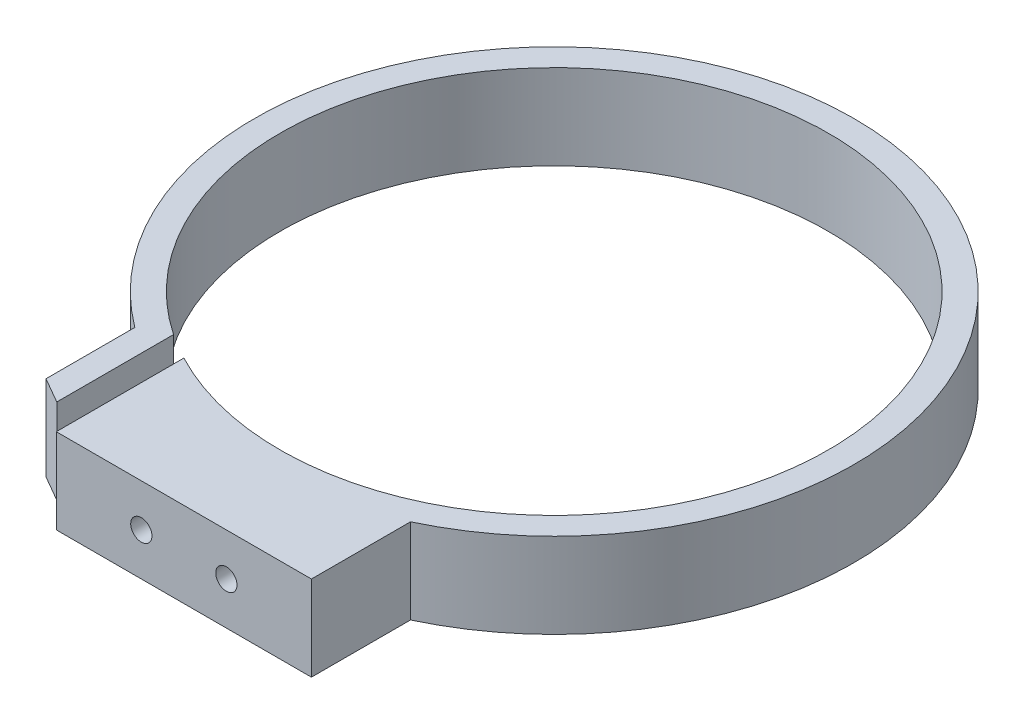
ISO-10303-21;
HEADER;
FILE_DESCRIPTION(('STEP AP214'),'2;1');
FILE_NAME('part.step','',(''),(''),'','','');
FILE_SCHEMA(('AUTOMOTIVE_DESIGN { 1 0 10303 214 1 1 1 1 }'));
ENDSEC;
DATA;
#1=APPLICATION_CONTEXT('core data for automotive mechanical design processes');
#2=APPLICATION_PROTOCOL_DEFINITION('international standard','automotive_design',2000,#1);
#3=PRODUCT_CONTEXT('',#1,'mechanical');
#4=PRODUCT('Part','Part','',(#3));
#5=PRODUCT_RELATED_PRODUCT_CATEGORY('part','',(#4));
#6=PRODUCT_DEFINITION_FORMATION('','',#4);
#7=PRODUCT_DEFINITION_CONTEXT('part definition',#1,'design');
#8=PRODUCT_DEFINITION('design','',#6,#7);
#9=PRODUCT_DEFINITION_SHAPE('','',#8);
#10=(LENGTH_UNIT() NAMED_UNIT(*) SI_UNIT(.MILLI.,.METRE.));
#11=(NAMED_UNIT(*) PLANE_ANGLE_UNIT() SI_UNIT($,.RADIAN.));
#12=(NAMED_UNIT(*) SI_UNIT($,.STERADIAN.) SOLID_ANGLE_UNIT());
#13=UNCERTAINTY_MEASURE_WITH_UNIT(LENGTH_MEASURE(1.E-05),#10,'distance_accuracy_value','');
#14=(GEOMETRIC_REPRESENTATION_CONTEXT(3) GLOBAL_UNCERTAINTY_ASSIGNED_CONTEXT((#13)) GLOBAL_UNIT_ASSIGNED_CONTEXT((#10,
#11,#12)) REPRESENTATION_CONTEXT('',''));
#15=CARTESIAN_POINT('',(0.,0.,0.));
#16=DIRECTION('',(0.,0.,1.));
#17=DIRECTION('',(1.,0.,0.));
#18=AXIS2_PLACEMENT_3D('',#15,#16,#17);
#19=CARTESIAN_POINT('',(0.,10.,0.));
#20=DIRECTION('',(0.,1.,0.));
#21=DIRECTION('',(0.,0.,1.));
#22=AXIS2_PLACEMENT_3D('',#19,#20,#21);
#23=PLANE('',#22);
#24=CARTESIAN_POINT('',(0.,10.,0.));
#25=DIRECTION('',(0.,1.,0.));
#26=DIRECTION('',(0.,0.,1.));
#27=AXIS2_PLACEMENT_3D('',#24,#25,#26);
#28=CIRCLE('',#27,35.25);
#29=CARTESIAN_POINT('',(15.,10.,31.8992554772051));
#30=VERTEX_POINT('',#29);
#31=CARTESIAN_POINT('',(-21.,10.,28.3118791322653));
#32=VERTEX_POINT('',#31);
#33=EDGE_CURVE('E173',#30,#32,#28,.T.);
#34=ORIENTED_EDGE('',*,*,#33,.T.);
#35=DIRECTION('',(0.,0.,1.));
#36=VECTOR('',#35,1.);
#37=CARTESIAN_POINT('',(-21.,10.,26.7593441623669));
#38=LINE('',#37,#36);
#39=CARTESIAN_POINT('',(-21.,10.,38.7593441623669));
#40=VERTEX_POINT('',#39);
#41=EDGE_CURVE('E140',#32,#40,#38,.T.);
#42=ORIENTED_EDGE('',*,*,#41,.T.);
#43=DIRECTION('',(0.866025403784437,0.,0.500000000000002));
#44=VECTOR('',#43,1.);
#45=CARTESIAN_POINT('',(-18.,10.,40.4913949699358));
#46=LINE('',#45,#44);
#47=CARTESIAN_POINT('',(-18.,10.,40.4913949699358));
#48=VERTEX_POINT('',#47);
#49=EDGE_CURVE('E149',#40,#48,#46,.T.);
#50=ORIENTED_EDGE('',*,*,#49,.T.);
#51=DIRECTION('',(0.,0.,1.));
#52=VECTOR('',#51,1.);
#53=CARTESIAN_POINT('',(-18.,10.,31.8992554772051));
#54=LINE('',#53,#52);
#55=CARTESIAN_POINT('',(-18.,10.,26.7593441623669));
#56=VERTEX_POINT('',#55);
#57=EDGE_CURVE('E147',#56,#48,#54,.T.);
#58=ORIENTED_EDGE('',*,*,#57,.F.);
#59=CARTESIAN_POINT('',(0.,10.,0.));
#60=DIRECTION('',(0.,1.,0.));
#61=DIRECTION('',(0.,0.,1.));
#62=AXIS2_PLACEMENT_3D('',#59,#60,#61);
#63=CIRCLE('',#62,32.25);
#64=CARTESIAN_POINT('',(-15.,10.,28.5492994660114));
#65=VERTEX_POINT('',#64);
#66=EDGE_CURVE('E161',#65,#56,#63,.T.);
#67=ORIENTED_EDGE('',*,*,#66,.F.);
#68=DIRECTION('',(0.,0.,1.));
#69=VECTOR('',#68,1.);
#70=CARTESIAN_POINT('',(-15.,10.,31.8992554772051));
#71=LINE('',#70,#69);
#72=CARTESIAN_POINT('',(-15.,10.,43.5492994660114));
#73=VERTEX_POINT('',#72);
#74=EDGE_CURVE('E175',#65,#73,#71,.T.);
#75=ORIENTED_EDGE('',*,*,#74,.T.);
#76=DIRECTION('',(1.,0.,0.));
#77=VECTOR('',#76,1.);
#78=CARTESIAN_POINT('',(-15.,10.,43.5492994660114));
#79=LINE('',#78,#77);
#80=CARTESIAN_POINT('',(15.,10.,43.5492994660114));
#81=VERTEX_POINT('',#80);
#82=EDGE_CURVE('E167',#73,#81,#79,.T.);
#83=ORIENTED_EDGE('',*,*,#82,.T.);
#84=DIRECTION('',(0.,0.,-1.));
#85=VECTOR('',#84,1.);
#86=CARTESIAN_POINT('',(15.,10.,43.5492994660114));
#87=LINE('',#86,#85);
#88=EDGE_CURVE('E170',#81,#30,#87,.T.);
#89=ORIENTED_EDGE('',*,*,#88,.T.);
#90=EDGE_LOOP('',(#34,#42,#50,#58,#67,#75,#83,#89));
#91=FACE_BOUND('',#90,.T.);
#92=ADVANCED_FACE('F37',(#91),#23,.T.);
#93=CARTESIAN_POINT('',(0.,0.,0.));
#94=DIRECTION('',(0.,1.,0.));
#95=DIRECTION('',(0.,0.,1.));
#96=AXIS2_PLACEMENT_3D('',#93,#94,#95);
#97=PLANE('',#96);
#98=DIRECTION('',(0.,0.,-1.));
#99=VECTOR('',#98,1.);
#100=CARTESIAN_POINT('',(-21.,0.,26.7593441623669));
#101=LINE('',#100,#99);
#102=CARTESIAN_POINT('',(-21.,0.,38.7593441623669));
#103=VERTEX_POINT('',#102);
#104=CARTESIAN_POINT('',(-21.,0.,28.3118791322653));
#105=VERTEX_POINT('',#104);
#106=EDGE_CURVE('E141',#103,#105,#101,.T.);
#107=ORIENTED_EDGE('',*,*,#106,.T.);
#108=CARTESIAN_POINT('',(0.,0.,0.));
#109=DIRECTION('',(0.,1.,0.));
#110=DIRECTION('',(0.,0.,1.));
#111=AXIS2_PLACEMENT_3D('',#108,#109,#110);
#112=CIRCLE('',#111,35.25);
#113=CARTESIAN_POINT('',(15.,0.,31.8992554772051));
#114=VERTEX_POINT('',#113);
#115=EDGE_CURVE('E55',#114,#105,#112,.T.);
#116=ORIENTED_EDGE('',*,*,#115,.F.);
#117=DIRECTION('',(0.,0.,-1.));
#118=VECTOR('',#117,1.);
#119=CARTESIAN_POINT('',(15.,0.,43.5492994660114));
#120=LINE('',#119,#118);
#121=CARTESIAN_POINT('',(15.,0.,43.5492994660114));
#122=VERTEX_POINT('',#121);
#123=EDGE_CURVE('E180',#122,#114,#120,.T.);
#124=ORIENTED_EDGE('',*,*,#123,.F.);
#125=DIRECTION('',(1.,0.,0.));
#126=VECTOR('',#125,1.);
#127=CARTESIAN_POINT('',(-15.,0.,43.5492994660114));
#128=LINE('',#127,#126);
#129=CARTESIAN_POINT('',(-15.,0.,43.5492994660114));
#130=VERTEX_POINT('',#129);
#131=EDGE_CURVE('E164',#130,#122,#128,.T.);
#132=ORIENTED_EDGE('',*,*,#131,.F.);
#133=DIRECTION('',(0.,0.,1.));
#134=VECTOR('',#133,1.);
#135=CARTESIAN_POINT('',(-15.,0.,31.8992554772051));
#136=LINE('',#135,#134);
#137=CARTESIAN_POINT('',(-15.,0.,28.5492994660114));
#138=VERTEX_POINT('',#137);
#139=EDGE_CURVE('E171',#138,#130,#136,.T.);
#140=ORIENTED_EDGE('',*,*,#139,.F.);
#141=CARTESIAN_POINT('',(0.,0.,0.));
#142=DIRECTION('',(0.,1.,0.));
#143=DIRECTION('',(0.,0.,1.));
#144=AXIS2_PLACEMENT_3D('',#141,#142,#143);
#145=CIRCLE('',#144,32.25);
#146=CARTESIAN_POINT('',(-18.,0.,26.7593441623669));
#147=VERTEX_POINT('',#146);
#148=EDGE_CURVE('E159',#138,#147,#145,.T.);
#149=ORIENTED_EDGE('',*,*,#148,.T.);
#150=DIRECTION('',(0.,0.,-1.));
#151=VECTOR('',#150,1.);
#152=CARTESIAN_POINT('',(-18.,0.,31.8992554772051));
#153=LINE('',#152,#151);
#154=CARTESIAN_POINT('',(-18.,0.,40.4913949699358));
#155=VERTEX_POINT('',#154);
#156=EDGE_CURVE('E157',#155,#147,#153,.T.);
#157=ORIENTED_EDGE('',*,*,#156,.F.);
#158=DIRECTION('',(-0.866025403784438,0.,-0.500000000000002));
#159=VECTOR('',#158,1.);
#160=CARTESIAN_POINT('',(-18.,0.,40.4913949699358));
#161=LINE('',#160,#159);
#162=EDGE_CURVE('E144',#155,#103,#161,.T.);
#163=ORIENTED_EDGE('',*,*,#162,.T.);
#164=EDGE_LOOP('',(#107,#116,#124,#132,#140,#149,#157,#163));
#165=FACE_BOUND('',#164,.T.);
#166=ADVANCED_FACE('F203',(#165),#97,.F.);
#167=CARTESIAN_POINT('',(-15.,10.,43.5492994660114));
#168=DIRECTION('',(0.,0.,-1.));
#169=DIRECTION('',(-1.,0.,0.));
#170=AXIS2_PLACEMENT_3D('',#167,#168,#169);
#171=PLANE('',#170);
#172=CARTESIAN_POINT('',(-5.,5.,43.5492994660114));
#173=DIRECTION('',(0.,0.,1.));
#174=DIRECTION('',(1.,0.,0.));
#175=AXIS2_PLACEMENT_3D('',#172,#173,#174);
#176=CIRCLE('',#175,1.24999999999999);
#177=CARTESIAN_POINT('',(-3.75000000000001,5.,43.5492994660114));
#178=VERTEX_POINT('',#177);
#179=EDGE_CURVE('E118',#178,#178,#176,.T.);
#180=ORIENTED_EDGE('',*,*,#179,.F.);
#181=EDGE_LOOP('',(#180));
#182=FACE_BOUND('',#181,.T.);
#183=CARTESIAN_POINT('',(5.,5.,43.5492994660114));
#184=DIRECTION('',(0.,0.,1.));
#185=DIRECTION('',(1.,0.,0.));
#186=AXIS2_PLACEMENT_3D('',#183,#184,#185);
#187=CIRCLE('',#186,1.24999999999999);
#188=CARTESIAN_POINT('',(6.24999999999999,5.,43.5492994660114));
#189=VERTEX_POINT('',#188);
#190=EDGE_CURVE('E117',#189,#189,#187,.T.);
#191=ORIENTED_EDGE('',*,*,#190,.F.);
#192=EDGE_LOOP('',(#191));
#193=FACE_BOUND('',#192,.T.);
#194=ORIENTED_EDGE('',*,*,#131,.T.);
#195=DIRECTION('',(0.,-1.,0.));
#196=VECTOR('',#195,1.);
#197=CARTESIAN_POINT('',(15.,10.,43.5492994660114));
#198=LINE('',#197,#196);
#199=EDGE_CURVE('E188',#81,#122,#198,.T.);
#200=ORIENTED_EDGE('',*,*,#199,.F.);
#201=ORIENTED_EDGE('',*,*,#82,.F.);
#202=DIRECTION('',(0.,-1.,0.));
#203=VECTOR('',#202,1.);
#204=CARTESIAN_POINT('',(-15.,10.,43.5492994660114));
#205=LINE('',#204,#203);
#206=EDGE_CURVE('E177',#73,#130,#205,.T.);
#207=ORIENTED_EDGE('',*,*,#206,.T.);
#208=EDGE_LOOP('',(#194,#200,#201,#207));
#209=FACE_BOUND('',#208,.T.);
#210=ADVANCED_FACE('F39',(#182,#193,#209),#171,.F.);
#211=CARTESIAN_POINT('',(15.,10.,43.5492994660114));
#212=DIRECTION('',(-1.,0.,0.));
#213=DIRECTION('',(0.,0.,1.));
#214=AXIS2_PLACEMENT_3D('',#211,#212,#213);
#215=PLANE('',#214);
#216=ORIENTED_EDGE('',*,*,#123,.T.);
#217=DIRECTION('',(0.,-1.,0.));
#218=VECTOR('',#217,1.);
#219=CARTESIAN_POINT('',(15.,10.,31.8992554772051));
#220=LINE('',#219,#218);
#221=EDGE_CURVE('E186',#30,#114,#220,.T.);
#222=ORIENTED_EDGE('',*,*,#221,.F.);
#223=ORIENTED_EDGE('',*,*,#88,.F.);
#224=ORIENTED_EDGE('',*,*,#199,.T.);
#225=EDGE_LOOP('',(#216,#222,#223,#224));
#226=FACE_BOUND('',#225,.T.);
#227=ADVANCED_FACE('F225',(#226),#215,.F.);
#228=CARTESIAN_POINT('',(0.,10.,0.));
#229=DIRECTION('',(0.,-1.,0.));
#230=DIRECTION('',(0.,0.,-1.));
#231=AXIS2_PLACEMENT_3D('',#228,#229,#230);
#232=CYLINDRICAL_SURFACE('',#231,35.25);
#233=ORIENTED_EDGE('',*,*,#115,.T.);
#234=DIRECTION('',(0.,-1.,0.));
#235=VECTOR('',#234,1.);
#236=CARTESIAN_POINT('',(-21.,10.,28.3118791322653));
#237=LINE('',#236,#235);
#238=EDGE_CURVE('E11',#105,#32,#237,.F.);
#239=ORIENTED_EDGE('',*,*,#238,.T.);
#240=ORIENTED_EDGE('',*,*,#33,.F.);
#241=ORIENTED_EDGE('',*,*,#221,.T.);
#242=EDGE_LOOP('',(#233,#239,#240,#241));
#243=FACE_BOUND('',#242,.T.);
#244=ADVANCED_FACE('F223',(#243),#232,.T.);
#245=CARTESIAN_POINT('',(-15.,10.,31.8992554772051));
#246=DIRECTION('',(1.,0.,0.));
#247=DIRECTION('',(0.,0.,-1.));
#248=AXIS2_PLACEMENT_3D('',#245,#246,#247);
#249=PLANE('',#248);
#250=CARTESIAN_POINT('',(-15.,5.,33.7593441623669));
#251=DIRECTION('',(-1.,0.,0.));
#252=DIRECTION('',(0.,0.,1.));
#253=AXIS2_PLACEMENT_3D('',#250,#251,#252);
#254=CIRCLE('',#253,1.25);
#255=CARTESIAN_POINT('',(-15.,5.,35.0093441623669));
#256=VERTEX_POINT('',#255);
#257=EDGE_CURVE('E128',#256,#256,#254,.T.);
#258=ORIENTED_EDGE('',*,*,#257,.F.);
#259=EDGE_LOOP('',(#258));
#260=FACE_BOUND('',#259,.T.);
#261=ORIENTED_EDGE('',*,*,#139,.T.);
#262=ORIENTED_EDGE('',*,*,#206,.F.);
#263=ORIENTED_EDGE('',*,*,#74,.F.);
#264=DIRECTION('',(0.,-1.,0.));
#265=VECTOR('',#264,1.);
#266=CARTESIAN_POINT('',(-15.,10.,28.5492994660114));
#267=LINE('',#266,#265);
#268=EDGE_CURVE('E45',#65,#138,#267,.T.);
#269=ORIENTED_EDGE('',*,*,#268,.T.);
#270=EDGE_LOOP('',(#261,#262,#263,#269));
#271=FACE_BOUND('',#270,.T.);
#272=ADVANCED_FACE('F196',(#260,#271),#249,.F.);
#273=CARTESIAN_POINT('',(0.,10.,0.));
#274=DIRECTION('',(0.,-1.,0.));
#275=DIRECTION('',(0.,0.,-1.));
#276=AXIS2_PLACEMENT_3D('',#273,#274,#275);
#277=CYLINDRICAL_SURFACE('',#276,32.25);
#278=ORIENTED_EDGE('',*,*,#268,.F.);
#279=ORIENTED_EDGE('',*,*,#66,.T.);
#280=DIRECTION('',(0.,-1.,0.));
#281=VECTOR('',#280,1.);
#282=CARTESIAN_POINT('',(-18.,10.,26.7593441623669));
#283=LINE('',#282,#281);
#284=EDGE_CURVE('E191',#147,#56,#283,.F.);
#285=ORIENTED_EDGE('',*,*,#284,.F.);
#286=ORIENTED_EDGE('',*,*,#148,.F.);
#287=EDGE_LOOP('',(#278,#279,#285,#286));
#288=FACE_BOUND('',#287,.T.);
#289=ADVANCED_FACE('F201',(#288),#277,.F.);
#290=CARTESIAN_POINT('',(-18.,-8.71908682983813,31.8992554772051));
#291=DIRECTION('',(-1.,0.,0.));
#292=DIRECTION('',(0.,0.,1.));
#293=AXIS2_PLACEMENT_3D('',#290,#291,#292);
#294=PLANE('',#293);
#295=CARTESIAN_POINT('',(-18.,5.,33.7593441623669));
#296=DIRECTION('',(-1.,0.,0.));
#297=DIRECTION('',(0.,0.,1.));
#298=AXIS2_PLACEMENT_3D('',#295,#296,#297);
#299=CIRCLE('',#298,1.7);
#300=CARTESIAN_POINT('',(-18.,5.,35.4593441623669));
#301=VERTEX_POINT('',#300);
#302=EDGE_CURVE('E137',#301,#301,#299,.T.);
#303=ORIENTED_EDGE('',*,*,#302,.T.);
#304=EDGE_LOOP('',(#303));
#305=FACE_BOUND('',#304,.T.);
#306=ORIENTED_EDGE('',*,*,#156,.T.);
#307=ORIENTED_EDGE('',*,*,#284,.T.);
#308=ORIENTED_EDGE('',*,*,#57,.T.);
#309=DIRECTION('',(0.,1.,0.));
#310=VECTOR('',#309,1.);
#311=CARTESIAN_POINT('',(-18.,-14.0559318218912,40.4913949699358));
#312=LINE('',#311,#310);
#313=EDGE_CURVE('E145',#155,#48,#312,.T.);
#314=ORIENTED_EDGE('',*,*,#313,.F.);
#315=EDGE_LOOP('',(#306,#307,#308,#314));
#316=FACE_BOUND('',#315,.T.);
#317=ADVANCED_FACE('F215',(#305,#316),#294,.F.);
#318=CARTESIAN_POINT('',(-21.,-14.0559318218912,26.7593441623669));
#319=DIRECTION('',(-1.,0.,0.));
#320=DIRECTION('',(0.,0.,1.));
#321=AXIS2_PLACEMENT_3D('',#318,#319,#320);
#322=PLANE('',#321);
#323=CARTESIAN_POINT('',(-21.,5.,33.7593441623669));
#324=DIRECTION('',(-1.,0.,0.));
#325=DIRECTION('',(0.,0.,1.));
#326=AXIS2_PLACEMENT_3D('',#323,#324,#325);
#327=CIRCLE('',#326,1.7);
#328=CARTESIAN_POINT('',(-21.,5.,35.4593441623669));
#329=VERTEX_POINT('',#328);
#330=EDGE_CURVE('E134',#329,#329,#327,.T.);
#331=ORIENTED_EDGE('',*,*,#330,.F.);
#332=EDGE_LOOP('',(#331));
#333=FACE_BOUND('',#332,.T.);
#334=ORIENTED_EDGE('',*,*,#238,.F.);
#335=ORIENTED_EDGE('',*,*,#106,.F.);
#336=DIRECTION('',(0.,1.,0.));
#337=VECTOR('',#336,1.);
#338=CARTESIAN_POINT('',(-21.,-14.0559318218912,38.7593441623669));
#339=LINE('',#338,#337);
#340=EDGE_CURVE('E152',#103,#40,#339,.T.);
#341=ORIENTED_EDGE('',*,*,#340,.T.);
#342=ORIENTED_EDGE('',*,*,#41,.F.);
#343=EDGE_LOOP('',(#334,#335,#341,#342));
#344=FACE_BOUND('',#343,.T.);
#345=ADVANCED_FACE('F221',(#333,#344),#322,.T.);
#346=CARTESIAN_POINT('',(-18.,-14.0559318218912,40.4913949699358));
#347=DIRECTION('',(-0.500000000000002,0.,0.866025403784438));
#348=DIRECTION('',(0.866025403784438,0.,0.500000000000002));
#349=AXIS2_PLACEMENT_3D('',#346,#347,#348);
#350=PLANE('',#349);
#351=ORIENTED_EDGE('',*,*,#162,.F.);
#352=ORIENTED_EDGE('',*,*,#313,.T.);
#353=ORIENTED_EDGE('',*,*,#49,.F.);
#354=ORIENTED_EDGE('',*,*,#340,.F.);
#355=EDGE_LOOP('',(#351,#352,#353,#354));
#356=FACE_BOUND('',#355,.T.);
#357=ADVANCED_FACE('F217',(#356),#350,.T.);
#358=CARTESIAN_POINT('',(-21.,5.,33.7593441623669));
#359=DIRECTION('',(-1.,0.,0.));
#360=DIRECTION('',(0.,0.,1.));
#361=AXIS2_PLACEMENT_3D('',#358,#359,#360);
#362=CYLINDRICAL_SURFACE('',#361,1.7);
#363=ORIENTED_EDGE('',*,*,#302,.F.);
#364=EDGE_LOOP('',(#363));
#365=FACE_BOUND('',#364,.T.);
#366=ORIENTED_EDGE('',*,*,#330,.T.);
#367=EDGE_LOOP('',(#366));
#368=FACE_BOUND('',#367,.T.);
#369=ADVANCED_FACE('F261',(#365,#368),#362,.F.);
#370=CARTESIAN_POINT('',(-6.5,5.,33.7593441623669));
#371=DIRECTION('',(-1.,0.,0.));
#372=DIRECTION('',(0.,0.,1.));
#373=AXIS2_PLACEMENT_3D('',#370,#371,#372);
#374=CONICAL_SURFACE('',#373,1.25,1.02974425867665);
#375=CARTESIAN_POINT('',(-5.74892422621555,5.,33.7593441623669));
#376=VERTEX_POINT('',#375);
#377=VERTEX_LOOP('',#376);
#378=FACE_BOUND('',#377,.T.);
#379=CARTESIAN_POINT('',(-6.5,5.,33.7593441623669));
#380=DIRECTION('',(-1.,0.,0.));
#381=DIRECTION('',(0.,0.,1.));
#382=AXIS2_PLACEMENT_3D('',#379,#380,#381);
#383=CIRCLE('',#382,1.25);
#384=CARTESIAN_POINT('',(-6.5,5.,35.0093441623669));
#385=VERTEX_POINT('',#384);
#386=EDGE_CURVE('E131',#385,#385,#383,.T.);
#387=ORIENTED_EDGE('',*,*,#386,.T.);
#388=EDGE_LOOP('',(#387));
#389=FACE_BOUND('',#388,.T.);
#390=ADVANCED_FACE('F252',(#378,#389),#374,.F.);
#391=CARTESIAN_POINT('',(-15.,5.,33.7593441623669));
#392=DIRECTION('',(-1.,0.,0.));
#393=DIRECTION('',(0.,0.,1.));
#394=AXIS2_PLACEMENT_3D('',#391,#392,#393);
#395=CYLINDRICAL_SURFACE('',#394,1.25);
#396=ORIENTED_EDGE('',*,*,#386,.F.);
#397=EDGE_LOOP('',(#396));
#398=FACE_BOUND('',#397,.T.);
#399=ORIENTED_EDGE('',*,*,#257,.T.);
#400=EDGE_LOOP('',(#399));
#401=FACE_BOUND('',#400,.T.);
#402=ADVANCED_FACE('F249',(#398,#401),#395,.F.);
#403=CARTESIAN_POINT('',(5.,5.,35.0492994660114));
#404=DIRECTION('',(0.,0.,1.));
#405=DIRECTION('',(1.,0.,0.));
#406=AXIS2_PLACEMENT_3D('',#403,#404,#405);
#407=CONICAL_SURFACE('',#406,1.25,1.02974425867665);
#408=CARTESIAN_POINT('',(5.,5.,34.298223692227));
#409=VERTEX_POINT('',#408);
#410=VERTEX_LOOP('',#409);
#411=FACE_BOUND('',#410,.T.);
#412=CARTESIAN_POINT('',(5.,5.,35.0492994660114));
#413=DIRECTION('',(0.,0.,1.));
#414=DIRECTION('',(1.,0.,0.));
#415=AXIS2_PLACEMENT_3D('',#412,#413,#414);
#416=CIRCLE('',#415,1.25);
#417=CARTESIAN_POINT('',(6.25,5.,35.0492994660114));
#418=VERTEX_POINT('',#417);
#419=EDGE_CURVE('E121',#418,#418,#416,.T.);
#420=ORIENTED_EDGE('',*,*,#419,.T.);
#421=EDGE_LOOP('',(#420));
#422=FACE_BOUND('',#421,.T.);
#423=ADVANCED_FACE('F251',(#411,#422),#407,.F.);
#424=CARTESIAN_POINT('',(5.,5.,43.5492994660114));
#425=DIRECTION('',(0.,0.,1.));
#426=DIRECTION('',(1.,0.,0.));
#427=AXIS2_PLACEMENT_3D('',#424,#425,#426);
#428=CYLINDRICAL_SURFACE('',#427,1.24999999999999);
#429=ORIENTED_EDGE('',*,*,#419,.F.);
#430=EDGE_LOOP('',(#429));
#431=FACE_BOUND('',#430,.T.);
#432=ORIENTED_EDGE('',*,*,#190,.T.);
#433=EDGE_LOOP('',(#432));
#434=FACE_BOUND('',#433,.T.);
#435=ADVANCED_FACE('F111',(#431,#434),#428,.F.);
#436=CARTESIAN_POINT('',(-5.,5.,35.0492994660114));
#437=DIRECTION('',(0.,0.,1.));
#438=DIRECTION('',(1.,0.,0.));
#439=AXIS2_PLACEMENT_3D('',#436,#437,#438);
#440=CONICAL_SURFACE('',#439,1.25,1.02974425867665);
#441=CARTESIAN_POINT('',(-5.,5.,34.298223692227));
#442=VERTEX_POINT('',#441);
#443=VERTEX_LOOP('',#442);
#444=FACE_BOUND('',#443,.T.);
#445=CARTESIAN_POINT('',(-5.,5.,35.0492994660114));
#446=DIRECTION('',(0.,0.,1.));
#447=DIRECTION('',(1.,0.,0.));
#448=AXIS2_PLACEMENT_3D('',#445,#446,#447);
#449=CIRCLE('',#448,1.25);
#450=CARTESIAN_POINT('',(-3.75,5.,35.0492994660114));
#451=VERTEX_POINT('',#450);
#452=EDGE_CURVE('E115',#451,#451,#449,.T.);
#453=ORIENTED_EDGE('',*,*,#452,.T.);
#454=EDGE_LOOP('',(#453));
#455=FACE_BOUND('',#454,.T.);
#456=ADVANCED_FACE('F107',(#444,#455),#440,.F.);
#457=CARTESIAN_POINT('',(-5.,5.,43.5492994660114));
#458=DIRECTION('',(0.,0.,1.));
#459=DIRECTION('',(1.,0.,0.));
#460=AXIS2_PLACEMENT_3D('',#457,#458,#459);
#461=CYLINDRICAL_SURFACE('',#460,1.24999999999999);
#462=ORIENTED_EDGE('',*,*,#452,.F.);
#463=EDGE_LOOP('',(#462));
#464=FACE_BOUND('',#463,.T.);
#465=ORIENTED_EDGE('',*,*,#179,.T.);
#466=EDGE_LOOP('',(#465));
#467=FACE_BOUND('',#466,.T.);
#468=ADVANCED_FACE('F110',(#464,#467),#461,.F.);
#469=CLOSED_SHELL('',(#92,#166,#210,#227,#244,#272,#289,#317,#345,#357,#369,#390,#402,#423,#435,
#456,#468));
#470=MANIFOLD_SOLID_BREP('B2',#469);
#471=ADVANCED_BREP_SHAPE_REPRESENTATION('',(#18,#470),#14);
#472=SHAPE_DEFINITION_REPRESENTATION(#9,#471);
ENDSEC;
END-ISO-10303-21;
